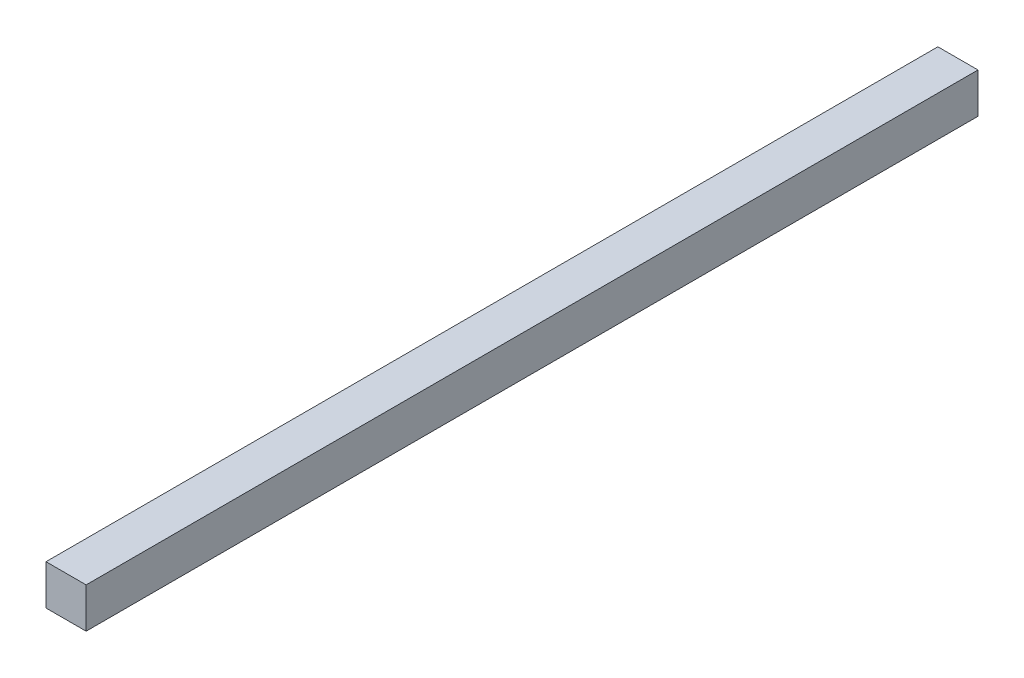
ISO-10303-21;
HEADER;
FILE_DESCRIPTION(('STEP AP214'),'2;1');
FILE_NAME('part.step','',(''),(''),'','','');
FILE_SCHEMA(('AUTOMOTIVE_DESIGN { 1 0 10303 214 1 1 1 1 }'));
ENDSEC;
DATA;
#1=APPLICATION_CONTEXT('core data for automotive mechanical design processes');
#2=APPLICATION_PROTOCOL_DEFINITION('international standard','automotive_design',2000,#1);
#3=PRODUCT_CONTEXT('',#1,'mechanical');
#4=PRODUCT('Part','Part','',(#3));
#5=PRODUCT_RELATED_PRODUCT_CATEGORY('part','',(#4));
#6=PRODUCT_DEFINITION_FORMATION('','',#4);
#7=PRODUCT_DEFINITION_CONTEXT('part definition',#1,'design');
#8=PRODUCT_DEFINITION('design','',#6,#7);
#9=PRODUCT_DEFINITION_SHAPE('','',#8);
#10=(LENGTH_UNIT() NAMED_UNIT(*) SI_UNIT(.MILLI.,.METRE.));
#11=(NAMED_UNIT(*) PLANE_ANGLE_UNIT() SI_UNIT($,.RADIAN.));
#12=(NAMED_UNIT(*) SI_UNIT($,.STERADIAN.) SOLID_ANGLE_UNIT());
#13=UNCERTAINTY_MEASURE_WITH_UNIT(LENGTH_MEASURE(1.E-05),#10,'distance_accuracy_value','');
#14=(GEOMETRIC_REPRESENTATION_CONTEXT(3) GLOBAL_UNCERTAINTY_ASSIGNED_CONTEXT((#13)) GLOBAL_UNIT_ASSIGNED_CONTEXT((#10,
#11,#12)) REPRESENTATION_CONTEXT('',''));
#15=CARTESIAN_POINT('',(0.,0.,0.));
#16=DIRECTION('',(0.,0.,1.));
#17=DIRECTION('',(1.,0.,0.));
#18=AXIS2_PLACEMENT_3D('',#15,#16,#17);
#19=CARTESIAN_POINT('',(8.99999999999999,-9.,400.));
#20=DIRECTION('',(-1.,0.,0.));
#21=DIRECTION('',(0.,0.,1.));
#22=AXIS2_PLACEMENT_3D('',#19,#20,#21);
#23=PLANE('',#22);
#24=DIRECTION('',(0.,1.,0.));
#25=VECTOR('',#24,1.);
#26=CARTESIAN_POINT('',(8.99999999999999,-9.,0.));
#27=LINE('',#26,#25);
#28=CARTESIAN_POINT('',(8.99999999999999,-9.,0.));
#29=VERTEX_POINT('',#28);
#30=CARTESIAN_POINT('',(8.99999999999999,9.,0.));
#31=VERTEX_POINT('',#30);
#32=EDGE_CURVE('E96',#29,#31,#27,.T.);
#33=ORIENTED_EDGE('',*,*,#32,.T.);
#34=DIRECTION('',(0.,0.,-1.));
#35=VECTOR('',#34,1.);
#36=CARTESIAN_POINT('',(8.99999999999999,9.,400.));
#37=LINE('',#36,#35);
#38=CARTESIAN_POINT('',(8.99999999999999,9.,400.));
#39=VERTEX_POINT('',#38);
#40=EDGE_CURVE('E11',#39,#31,#37,.T.);
#41=ORIENTED_EDGE('',*,*,#40,.F.);
#42=DIRECTION('',(0.,1.,0.));
#43=VECTOR('',#42,1.);
#44=CARTESIAN_POINT('',(8.99999999999999,-9.,400.));
#45=LINE('',#44,#43);
#46=CARTESIAN_POINT('',(8.99999999999999,-9.,400.));
#47=VERTEX_POINT('',#46);
#48=EDGE_CURVE('E84',#47,#39,#45,.T.);
#49=ORIENTED_EDGE('',*,*,#48,.F.);
#50=DIRECTION('',(0.,0.,-1.));
#51=VECTOR('',#50,1.);
#52=CARTESIAN_POINT('',(8.99999999999999,-9.,400.));
#53=LINE('',#52,#51);
#54=EDGE_CURVE('E92',#47,#29,#53,.T.);
#55=ORIENTED_EDGE('',*,*,#54,.T.);
#56=EDGE_LOOP('',(#33,#41,#49,#55));
#57=FACE_BOUND('',#56,.T.);
#58=ADVANCED_FACE('F33',(#57),#23,.F.);
#59=CARTESIAN_POINT('',(-9.00000000000001,9.,400.));
#60=DIRECTION('',(0.,-1.,0.));
#61=DIRECTION('',(0.,0.,-1.));
#62=AXIS2_PLACEMENT_3D('',#59,#60,#61);
#63=PLANE('',#62);
#64=DIRECTION('',(-1.,0.,0.));
#65=VECTOR('',#64,1.);
#66=CARTESIAN_POINT('',(-9.00000000000001,9.,0.));
#67=LINE('',#66,#65);
#68=CARTESIAN_POINT('',(-9.00000000000001,9.,0.));
#69=VERTEX_POINT('',#68);
#70=EDGE_CURVE('E88',#31,#69,#67,.T.);
#71=ORIENTED_EDGE('',*,*,#70,.T.);
#72=DIRECTION('',(0.,0.,-1.));
#73=VECTOR('',#72,1.);
#74=CARTESIAN_POINT('',(-9.00000000000001,9.,400.));
#75=LINE('',#74,#73);
#76=CARTESIAN_POINT('',(-9.00000000000001,9.,400.));
#77=VERTEX_POINT('',#76);
#78=EDGE_CURVE('E41',#77,#69,#75,.T.);
#79=ORIENTED_EDGE('',*,*,#78,.F.);
#80=DIRECTION('',(-1.,0.,0.));
#81=VECTOR('',#80,1.);
#82=CARTESIAN_POINT('',(-9.00000000000001,9.,400.));
#83=LINE('',#82,#81);
#84=EDGE_CURVE('E79',#39,#77,#83,.T.);
#85=ORIENTED_EDGE('',*,*,#84,.F.);
#86=ORIENTED_EDGE('',*,*,#40,.T.);
#87=EDGE_LOOP('',(#71,#79,#85,#86));
#88=FACE_BOUND('',#87,.T.);
#89=ADVANCED_FACE('F87',(#88),#63,.F.);
#90=CARTESIAN_POINT('',(-9.00000000000001,-9.,400.));
#91=DIRECTION('',(1.,0.,0.));
#92=DIRECTION('',(0.,0.,-1.));
#93=AXIS2_PLACEMENT_3D('',#90,#91,#92);
#94=PLANE('',#93);
#95=DIRECTION('',(0.,-1.,0.));
#96=VECTOR('',#95,1.);
#97=CARTESIAN_POINT('',(-9.00000000000001,-9.,0.));
#98=LINE('',#97,#96);
#99=CARTESIAN_POINT('',(-9.00000000000001,-9.,0.));
#100=VERTEX_POINT('',#99);
#101=EDGE_CURVE('E66',#69,#100,#98,.T.);
#102=ORIENTED_EDGE('',*,*,#101,.T.);
#103=DIRECTION('',(0.,0.,-1.));
#104=VECTOR('',#103,1.);
#105=CARTESIAN_POINT('',(-9.00000000000001,-9.,400.));
#106=LINE('',#105,#104);
#107=CARTESIAN_POINT('',(-9.00000000000001,-9.,400.));
#108=VERTEX_POINT('',#107);
#109=EDGE_CURVE('E89',#108,#100,#106,.T.);
#110=ORIENTED_EDGE('',*,*,#109,.F.);
#111=DIRECTION('',(0.,-1.,0.));
#112=VECTOR('',#111,1.);
#113=CARTESIAN_POINT('',(-9.00000000000001,-9.,400.));
#114=LINE('',#113,#112);
#115=EDGE_CURVE('E82',#77,#108,#114,.T.);
#116=ORIENTED_EDGE('',*,*,#115,.F.);
#117=ORIENTED_EDGE('',*,*,#78,.T.);
#118=EDGE_LOOP('',(#102,#110,#116,#117));
#119=FACE_BOUND('',#118,.T.);
#120=ADVANCED_FACE('F90',(#119),#94,.F.);
#121=CARTESIAN_POINT('',(-9.00000000000001,-9.,400.));
#122=DIRECTION('',(0.,1.,0.));
#123=DIRECTION('',(0.,0.,1.));
#124=AXIS2_PLACEMENT_3D('',#121,#122,#123);
#125=PLANE('',#124);
#126=DIRECTION('',(1.,0.,0.));
#127=VECTOR('',#126,1.);
#128=CARTESIAN_POINT('',(-9.00000000000001,-9.,0.));
#129=LINE('',#128,#127);
#130=EDGE_CURVE('E72',#100,#29,#129,.T.);
#131=ORIENTED_EDGE('',*,*,#130,.T.);
#132=ORIENTED_EDGE('',*,*,#54,.F.);
#133=DIRECTION('',(1.,0.,0.));
#134=VECTOR('',#133,1.);
#135=CARTESIAN_POINT('',(-9.00000000000001,-9.,400.));
#136=LINE('',#135,#134);
#137=EDGE_CURVE('E49',#108,#47,#136,.T.);
#138=ORIENTED_EDGE('',*,*,#137,.F.);
#139=ORIENTED_EDGE('',*,*,#109,.T.);
#140=EDGE_LOOP('',(#131,#132,#138,#139));
#141=FACE_BOUND('',#140,.T.);
#142=ADVANCED_FACE('F103',(#141),#125,.F.);
#143=CARTESIAN_POINT('',(0.,0.,400.));
#144=DIRECTION('',(0.,0.,-1.));
#145=DIRECTION('',(-1.,0.,0.));
#146=AXIS2_PLACEMENT_3D('',#143,#144,#145);
#147=PLANE('',#146);
#148=ORIENTED_EDGE('',*,*,#48,.T.);
#149=ORIENTED_EDGE('',*,*,#84,.T.);
#150=ORIENTED_EDGE('',*,*,#115,.T.);
#151=ORIENTED_EDGE('',*,*,#137,.T.);
#152=EDGE_LOOP('',(#148,#149,#150,#151));
#153=FACE_BOUND('',#152,.T.);
#154=ADVANCED_FACE('F80',(#153),#147,.F.);
#155=CARTESIAN_POINT('',(0.,0.,0.));
#156=DIRECTION('',(0.,0.,-1.));
#157=DIRECTION('',(-1.,0.,0.));
#158=AXIS2_PLACEMENT_3D('',#155,#156,#157);
#159=PLANE('',#158);
#160=ORIENTED_EDGE('',*,*,#32,.F.);
#161=ORIENTED_EDGE('',*,*,#130,.F.);
#162=ORIENTED_EDGE('',*,*,#101,.F.);
#163=ORIENTED_EDGE('',*,*,#70,.F.);
#164=EDGE_LOOP('',(#160,#161,#162,#163));
#165=FACE_BOUND('',#164,.T.);
#166=ADVANCED_FACE('F106',(#165),#159,.T.);
#167=CLOSED_SHELL('',(#58,#89,#120,#142,#154,#166));
#168=MANIFOLD_SOLID_BREP('B2',#167);
#169=ADVANCED_BREP_SHAPE_REPRESENTATION('',(#18,#168),#14);
#170=SHAPE_DEFINITION_REPRESENTATION(#9,#169);
ENDSEC;
END-ISO-10303-21;
